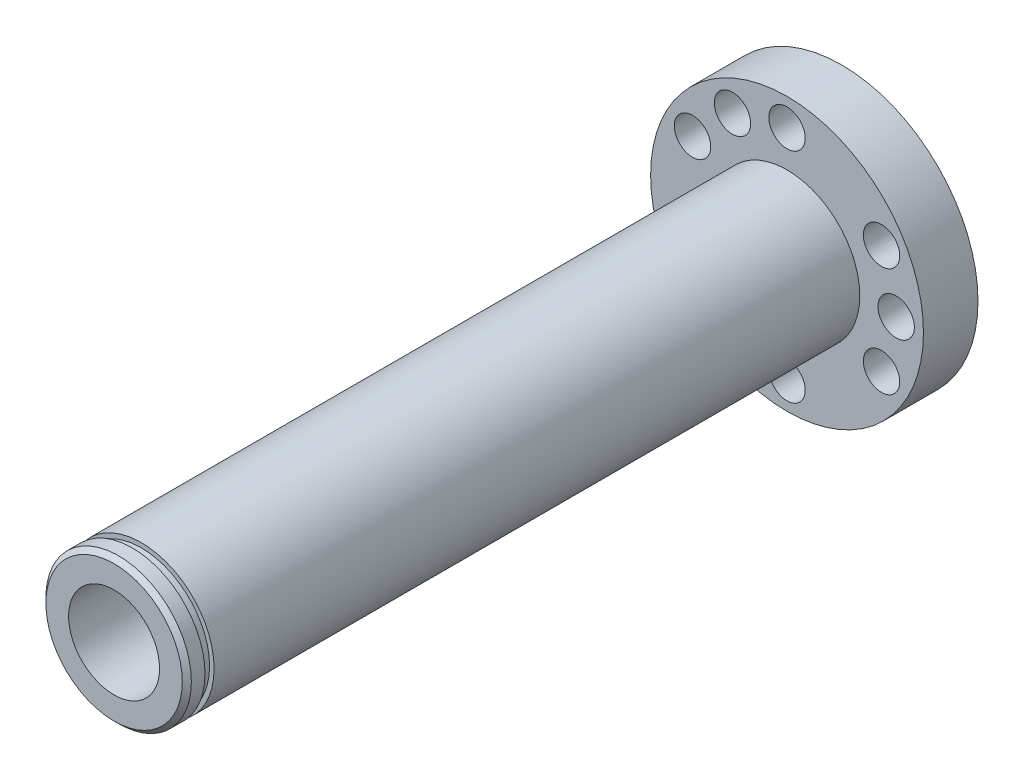
ISO-10303-21;
HEADER;
FILE_DESCRIPTION(('STEP AP214'),'2;1');
FILE_NAME('part.step','',(''),(''),'','','');
FILE_SCHEMA(('AUTOMOTIVE_DESIGN { 1 0 10303 214 1 1 1 1 }'));
ENDSEC;
DATA;
#1=APPLICATION_CONTEXT('core data for automotive mechanical design processes');
#2=APPLICATION_PROTOCOL_DEFINITION('international standard','automotive_design',2000,#1);
#3=PRODUCT_CONTEXT('',#1,'mechanical');
#4=PRODUCT('Part','Part','',(#3));
#5=PRODUCT_RELATED_PRODUCT_CATEGORY('part','',(#4));
#6=PRODUCT_DEFINITION_FORMATION('','',#4);
#7=PRODUCT_DEFINITION_CONTEXT('part definition',#1,'design');
#8=PRODUCT_DEFINITION('design','',#6,#7);
#9=PRODUCT_DEFINITION_SHAPE('','',#8);
#10=(LENGTH_UNIT() NAMED_UNIT(*) SI_UNIT(.MILLI.,.METRE.));
#11=(NAMED_UNIT(*) PLANE_ANGLE_UNIT() SI_UNIT($,.RADIAN.));
#12=(NAMED_UNIT(*) SI_UNIT($,.STERADIAN.) SOLID_ANGLE_UNIT());
#13=UNCERTAINTY_MEASURE_WITH_UNIT(LENGTH_MEASURE(1.E-05),#10,'distance_accuracy_value','');
#14=(GEOMETRIC_REPRESENTATION_CONTEXT(3) GLOBAL_UNCERTAINTY_ASSIGNED_CONTEXT((#13)) GLOBAL_UNIT_ASSIGNED_CONTEXT((#10,
#11,#12)) REPRESENTATION_CONTEXT('',''));
#15=CARTESIAN_POINT('',(0.,0.,0.));
#16=DIRECTION('',(0.,0.,1.));
#17=DIRECTION('',(1.,0.,0.));
#18=AXIS2_PLACEMENT_3D('',#15,#16,#17);
#19=CARTESIAN_POINT('',(0.,0.,80.));
#20=DIRECTION('',(0.,0.,-1.));
#21=DIRECTION('',(-1.,0.,0.));
#22=AXIS2_PLACEMENT_3D('',#19,#20,#21);
#23=CYLINDRICAL_SURFACE('',#22,8.);
#24=CARTESIAN_POINT('',(0.,0.,79.5));
#25=DIRECTION('',(0.,0.,1.));
#26=DIRECTION('',(1.,0.,0.));
#27=AXIS2_PLACEMENT_3D('',#24,#25,#26);
#28=CIRCLE('',#27,8.);
#29=CARTESIAN_POINT('',(8.,0.,79.5));
#30=VERTEX_POINT('',#29);
#31=EDGE_CURVE('E13',#30,#30,#28,.F.);
#32=ORIENTED_EDGE('',*,*,#31,.T.);
#33=EDGE_LOOP('',(#32));
#34=FACE_BOUND('',#33,.T.);
#35=CARTESIAN_POINT('',(0.,0.,78.));
#36=DIRECTION('',(0.,0.,1.));
#37=DIRECTION('',(1.,0.,0.));
#38=AXIS2_PLACEMENT_3D('',#35,#36,#37);
#39=CIRCLE('',#38,8.);
#40=CARTESIAN_POINT('',(8.,0.,78.));
#41=VERTEX_POINT('',#40);
#42=EDGE_CURVE('E57',#41,#41,#39,.T.);
#43=ORIENTED_EDGE('',*,*,#42,.T.);
#44=EDGE_LOOP('',(#43));
#45=FACE_BOUND('',#44,.T.);
#46=ADVANCED_FACE('F41',(#34,#45),#23,.T.);
#47=CARTESIAN_POINT('',(0.,0.,6.));
#48=DIRECTION('',(0.,0.,1.));
#49=DIRECTION('',(1.,0.,0.));
#50=AXIS2_PLACEMENT_3D('',#47,#48,#49);
#51=CIRCLE('',#50,8.);
#52=CARTESIAN_POINT('',(8.,0.,6.));
#53=VERTEX_POINT('',#52);
#54=EDGE_CURVE('E86',#53,#53,#51,.T.);
#55=ORIENTED_EDGE('',*,*,#54,.T.);
#56=EDGE_LOOP('',(#55));
#57=FACE_BOUND('',#56,.T.);
#58=CARTESIAN_POINT('',(0.676832818988865,-7.97131716438002,61.5));
#59=CARTESIAN_POINT('',(0.816152723476275,-7.95948569860907,61.4999975573903));
#60=CARTESIAN_POINT('',(0.955182356315616,-7.94396780468581,61.4883138764017));
#61=CARTESIAN_POINT('',(1.22853718217582,-7.90631197241579,61.4423058152738));
#62=CARTESIAN_POINT('',(1.36286003509707,-7.88417079186767,61.4079703367837));
#63=CARTESIAN_POINT('',(1.62286304428341,-7.834781390873,61.3181685294789));
#64=CARTESIAN_POINT('',(1.74856187779496,-7.80754471584264,61.2627496837744));
#65=CARTESIAN_POINT('',(1.98867007536127,-7.74986822250272,61.1325445753611));
#66=CARTESIAN_POINT('',(2.10307780793544,-7.71942794260518,61.0577555194421));
#67=CARTESIAN_POINT('',(2.32221134305673,-7.65642439165967,60.8875145945021));
#68=CARTESIAN_POINT('',(2.4263960028701,-7.62382449143263,60.7913790250547));
#69=CARTESIAN_POINT('',(2.61732736387712,-7.5604059668264,60.5825613952464));
#70=CARTESIAN_POINT('',(2.70407029192044,-7.52958772889738,60.4698757637329));
#71=CARTESIAN_POINT('',(2.85877237093187,-7.47223827697353,60.2287966500179));
#72=CARTESIAN_POINT('',(2.92643924143155,-7.44577611256991,60.1001981171049));
#73=CARTESIAN_POINT('',(3.03877635688938,-7.40064442830828,59.8320562650993));
#74=CARTESIAN_POINT('',(3.08345994564867,-7.38197038795862,59.6925193510498));
#75=CARTESIAN_POINT('',(3.14587276351866,-7.3555808810127,59.4156102118671));
#76=CARTESIAN_POINT('',(3.16508865060036,-7.34726291169789,59.2786312040606));
#77=CARTESIAN_POINT('',(3.18063000993129,-7.34055022270851,59.003160622223));
#78=CARTESIAN_POINT('',(3.17696426914512,-7.34215169378514,58.8646696492071));
#79=CARTESIAN_POINT('',(3.14784830138872,-7.35467619814316,58.5988940436775));
#80=CARTESIAN_POINT('',(3.12371503319679,-7.36503558807106,58.4714347958744));
#81=CARTESIAN_POINT('',(3.05636822646456,-7.39323568385427,58.2225434037444));
#82=CARTESIAN_POINT('',(3.01315182117508,-7.41107751373296,58.1011121680209));
#83=CARTESIAN_POINT('',(2.90774209272279,-7.45307454694269,57.8640813493935));
#84=CARTESIAN_POINT('',(2.84508179379319,-7.47738273501315,57.7487175069686));
#85=CARTESIAN_POINT('',(2.70303412084004,-7.5298958254571,57.5297779668181));
#86=CARTESIAN_POINT('',(2.62364086323714,-7.55810209725577,57.4262064352415));
#87=CARTESIAN_POINT('',(2.44350683886302,-7.61832891611981,57.2256381561722));
#88=CARTESIAN_POINT('',(2.3416134068799,-7.65047695233039,57.1297128757887));
#89=CARTESIAN_POINT('',(2.12310768799272,-7.71397115168236,56.956039565962));
#90=CARTESIAN_POINT('',(2.00649174979972,-7.7453171135761,56.8782960594217));
#91=CARTESIAN_POINT('',(1.7574460253123,-7.80565668315108,56.7409955286279));
#92=CARTESIAN_POINT('',(1.62463925902297,-7.83454783392614,56.6820738377771));
#93=CARTESIAN_POINT('',(1.34981098484143,-7.88654137035326,56.5879095372691));
#94=CARTESIAN_POINT('',(1.20779229825479,-7.90964551793191,56.5526597149029));
#95=CARTESIAN_POINT('',(0.924507812297479,-7.94763449444304,56.5083361439591));
#96=CARTESIAN_POINT('',(0.783434782221008,-7.96280850164499,56.498281377441));
#97=CARTESIAN_POINT('',(0.501020096605036,-7.98555115301308,56.5021976575859));
#98=CARTESIAN_POINT('',(0.359678529163902,-7.99312196524782,56.5161618521041));
#99=CARTESIAN_POINT('',(0.0875113107585066,-8.00062862557216,56.5666904687729));
#100=CARTESIAN_POINT('',(-0.043501216194487,-8.00089310448273,56.6022082707468));
#101=CARTESIAN_POINT('',(-0.297945069211814,-7.99546318183781,56.6939001948693));
#102=CARTESIAN_POINT('',(-0.421376196367577,-7.98976862400935,56.7500748587094));
#103=CARTESIAN_POINT('',(-0.65778871127648,-7.97379624996889,56.8817062971809));
#104=CARTESIAN_POINT('',(-0.770726249744449,-7.96350016191201,56.9572394256534));
#105=CARTESIAN_POINT('',(-0.982742031358332,-7.94012675140975,57.1253993691777));
#106=CARTESIAN_POINT('',(-1.08181757161549,-7.92704888780784,57.2180295097558));
#107=CARTESIAN_POINT('',(-1.26668859452385,-7.89965415310074,57.4213241629704));
#108=CARTESIAN_POINT('',(-1.35193576615051,-7.88531059545626,57.532484242568));
#109=CARTESIAN_POINT('',(-1.50276953949086,-7.85796281343705,57.7675872396676));
#110=CARTESIAN_POINT('',(-1.56835504238996,-7.8449586639433,57.8915308710727));
#111=CARTESIAN_POINT('',(-1.67851312043485,-7.82213576347272,58.1501304478844));
#112=CARTESIAN_POINT('',(-1.7228803760987,-7.81234841310758,58.2848768908353));
#113=CARTESIAN_POINT('',(-1.78823484894878,-7.79765062179989,58.5601741242955));
#114=CARTESIAN_POINT('',(-1.80922651804465,-7.79273925224004,58.7007238042812));
#115=CARTESIAN_POINT('',(-1.82691676715211,-7.78861056444681,58.9801879582911));
#116=CARTESIAN_POINT('',(-1.82416043030619,-7.78926547966249,59.1190662182135));
#117=CARTESIAN_POINT('',(-1.79574712044427,-7.79586427033478,59.3943242144726));
#118=CARTESIAN_POINT('',(-1.77009064709956,-7.80180803039103,59.5307040052584));
#119=CARTESIAN_POINT('',(-1.69701967920586,-7.81802379862739,59.7959912560694));
#120=CARTESIAN_POINT('',(-1.64978712954827,-7.8282595555297,59.9249512439486));
#121=CARTESIAN_POINT('',(-1.53501415558272,-7.85156955021423,60.1732189087446));
#122=CARTESIAN_POINT('',(-1.46747069484165,-7.86464421232478,60.2925251390607));
#123=CARTESIAN_POINT('',(-1.31215374336306,-7.89205881411277,60.5209998018899));
#124=CARTESIAN_POINT('',(-1.22395850740403,-7.90642063352876,60.6298790461793));
#125=CARTESIAN_POINT('',(-1.03054080705318,-7.93394656034171,60.831500111932));
#126=CARTESIAN_POINT('',(-0.92531606141522,-7.94711050690392,60.9242397679025));
#127=CARTESIAN_POINT('',(-0.69950705512239,-7.97017414452472,61.0918038721571));
#128=CARTESIAN_POINT('',(-0.578783734982513,-7.98004094090107,61.1664458573356));
#129=CARTESIAN_POINT('',(-0.326224183074277,-7.99434357732223,61.294315713331));
#130=CARTESIAN_POINT('',(-0.194394123159528,-7.99878241260586,61.3475553834017));
#131=CARTESIAN_POINT('',(0.0601004951071713,-8.00066211185782,61.4259405656546));
#132=CARTESIAN_POINT('',(0.181962679028228,-7.99887983670041,61.4536933668292));
#133=CARTESIAN_POINT('',(0.428237819034956,-7.98948015901659,61.4907236449033));
#134=CARTESIAN_POINT('',(0.552650628996991,-7.98186308985748,61.5000021772095));
#135=CARTESIAN_POINT('',(0.676832818988865,-7.97131716438002,61.5));
#136=B_SPLINE_CURVE_WITH_KNOTS('',3,(#58,#59,#60,#61,#62,#63,#64,#65,#66,#67,#68,#69,#70,#71,
#72,#73,#74,#75,#76,#77,#78,#79,#80,#81,#82,#83,#84,#85,#86,#87,#88,#89,#90,#91,#92,#93,#94,#95,
#96,#97,#98,#99,#100,#101,#102,#103,#104,#105,#106,#107,#108,#109,#110,#111,#112,#113,#114,#115,
#116,#117,#118,#119,#120,#121,#122,#123,#124,#125,#126,#127,#128,#129,#130,#131,#132,#133,#134,
#135),.UNSPECIFIED.,.T.,.F.,(4,2,2,2,2,2,2,2,2,2,2,2,2,2,2,2,2,2,2,2,2,2,2,2,2,2,2,2,2,2,2,2,2,
2,2,2,2,2,4),(0.,0.418992236702692,0.838189913164174,1.25644902555785,1.67476848508866,
2.10916625723917,2.54365790131059,2.98448389330602,3.42505365761941,3.83857006529578,
4.2519276848623,4.64054535772789,5.02922143024792,5.42806793243236,5.82705491017595,
6.25588948360684,6.68483062084014,7.12701000760924,7.56905460315611,7.99359947304964,
8.41802324859069,8.82332425048391,9.22863588147452,9.63557143187398,10.0425862185582,
10.4630771533692,10.8835915834124,11.3080966984312,11.7325209520865,12.1472298987808,
12.5619297969224,12.9731954282485,13.384522573405,13.8051228493199,14.2257795148891,
14.6505156905575,15.0750173838522,15.4485056263453,15.8219725314136),.UNSPECIFIED.);
#137=CARTESIAN_POINT('',(0.676832818988865,-7.97131716438002,61.5));
#138=VERTEX_POINT('',#137);
#139=EDGE_CURVE('E117',#138,#138,#136,.T.);
#140=ORIENTED_EDGE('',*,*,#139,.T.);
#141=EDGE_LOOP('',(#140));
#142=FACE_BOUND('',#141,.T.);
#143=CARTESIAN_POINT('',(0.,0.,77.));
#144=DIRECTION('',(0.,0.,1.));
#145=DIRECTION('',(1.,0.,0.));
#146=AXIS2_PLACEMENT_3D('',#143,#144,#145);
#147=CIRCLE('',#146,8.);
#148=CARTESIAN_POINT('',(8.,0.,77.));
#149=VERTEX_POINT('',#148);
#150=EDGE_CURVE('E64',#149,#149,#147,.T.);
#151=ORIENTED_EDGE('',*,*,#150,.F.);
#152=EDGE_LOOP('',(#151));
#153=FACE_BOUND('',#152,.T.);
#154=ADVANCED_FACE('F155',(#57,#142,#153),#23,.T.);
#155=CARTESIAN_POINT('',(0.,0.,80.));
#156=DIRECTION('',(0.,0.,-1.));
#157=DIRECTION('',(-1.,0.,0.));
#158=AXIS2_PLACEMENT_3D('',#155,#156,#157);
#159=CONICAL_SURFACE('',#158,7.5,0.785398163397448);
#160=CARTESIAN_POINT('',(0.,0.,80.));
#161=DIRECTION('',(0.,0.,1.));
#162=DIRECTION('',(1.,0.,0.));
#163=AXIS2_PLACEMENT_3D('',#160,#161,#162);
#164=CIRCLE('',#163,7.5);
#165=CARTESIAN_POINT('',(7.5,0.,80.));
#166=VERTEX_POINT('',#165);
#167=EDGE_CURVE('E50',#166,#166,#164,.T.);
#168=ORIENTED_EDGE('',*,*,#167,.F.);
#169=EDGE_LOOP('',(#168));
#170=FACE_BOUND('',#169,.T.);
#171=ORIENTED_EDGE('',*,*,#31,.F.);
#172=EDGE_LOOP('',(#171));
#173=FACE_BOUND('',#172,.T.);
#174=ADVANCED_FACE('F44',(#170,#173),#159,.T.);
#175=CARTESIAN_POINT('',(0.,0.,10.));
#176=DIRECTION('',(0.,0.,-1.));
#177=DIRECTION('',(-1.,0.,0.));
#178=AXIS2_PLACEMENT_3D('',#175,#176,#177);
#179=CYLINDRICAL_SURFACE('',#178,15.);
#180=CARTESIAN_POINT('',(0.,0.,0.));
#181=DIRECTION('',(0.,0.,1.));
#182=DIRECTION('',(1.,0.,0.));
#183=AXIS2_PLACEMENT_3D('',#180,#181,#182);
#184=CIRCLE('',#183,15.);
#185=CARTESIAN_POINT('',(15.,0.,0.));
#186=VERTEX_POINT('',#185);
#187=EDGE_CURVE('E150',#186,#186,#184,.T.);
#188=ORIENTED_EDGE('',*,*,#187,.T.);
#189=EDGE_LOOP('',(#188));
#190=FACE_BOUND('',#189,.T.);
#191=CARTESIAN_POINT('',(0.,0.,6.));
#192=DIRECTION('',(0.,0.,1.));
#193=DIRECTION('',(1.,0.,0.));
#194=AXIS2_PLACEMENT_3D('',#191,#192,#193);
#195=CIRCLE('',#194,15.);
#196=CARTESIAN_POINT('',(15.,0.,6.));
#197=VERTEX_POINT('',#196);
#198=EDGE_CURVE('E114',#197,#197,#195,.T.);
#199=ORIENTED_EDGE('',*,*,#198,.F.);
#200=EDGE_LOOP('',(#199));
#201=FACE_BOUND('',#200,.T.);
#202=ADVANCED_FACE('F191',(#190,#201),#179,.T.);
#203=CARTESIAN_POINT('',(0.,12.,10.));
#204=DIRECTION('',(0.,0.,-1.));
#205=DIRECTION('',(-1.,0.,0.));
#206=AXIS2_PLACEMENT_3D('',#203,#204,#205);
#207=CYLINDRICAL_SURFACE('',#206,2.);
#208=CARTESIAN_POINT('',(0.,12.,0.));
#209=DIRECTION('',(0.,0.,1.));
#210=DIRECTION('',(1.,0.,0.));
#211=AXIS2_PLACEMENT_3D('',#208,#209,#210);
#212=CIRCLE('',#211,2.);
#213=CARTESIAN_POINT('',(2.,12.,0.));
#214=VERTEX_POINT('',#213);
#215=EDGE_CURVE('E200',#214,#214,#212,.T.);
#216=ORIENTED_EDGE('',*,*,#215,.F.);
#217=EDGE_LOOP('',(#216));
#218=FACE_BOUND('',#217,.T.);
#219=CARTESIAN_POINT('',(0.,12.,6.));
#220=DIRECTION('',(0.,0.,1.));
#221=DIRECTION('',(1.,0.,0.));
#222=AXIS2_PLACEMENT_3D('',#219,#220,#221);
#223=CIRCLE('',#222,2.);
#224=CARTESIAN_POINT('',(2.,12.,6.));
#225=VERTEX_POINT('',#224);
#226=EDGE_CURVE('E111',#225,#225,#223,.T.);
#227=ORIENTED_EDGE('',*,*,#226,.T.);
#228=EDGE_LOOP('',(#227));
#229=FACE_BOUND('',#228,.T.);
#230=ADVANCED_FACE('F188',(#218,#229),#207,.F.);
#231=CARTESIAN_POINT('',(-6.00000000000002,10.3923048454133,10.));
#232=DIRECTION('',(0.,0.,-1.));
#233=DIRECTION('',(-1.,0.,0.));
#234=AXIS2_PLACEMENT_3D('',#231,#232,#233);
#235=CYLINDRICAL_SURFACE('',#234,2.);
#236=CARTESIAN_POINT('',(-6.00000000000002,10.3923048454133,0.));
#237=DIRECTION('',(0.,0.,1.));
#238=DIRECTION('',(1.,0.,0.));
#239=AXIS2_PLACEMENT_3D('',#236,#237,#238);
#240=CIRCLE('',#239,2.);
#241=CARTESIAN_POINT('',(-4.00000000000002,10.3923048454133,0.));
#242=VERTEX_POINT('',#241);
#243=EDGE_CURVE('E263',#242,#242,#240,.T.);
#244=ORIENTED_EDGE('',*,*,#243,.F.);
#245=EDGE_LOOP('',(#244));
#246=FACE_BOUND('',#245,.T.);
#247=CARTESIAN_POINT('',(-6.00000000000002,10.3923048454133,6.));
#248=DIRECTION('',(0.,0.,1.));
#249=DIRECTION('',(1.,0.,0.));
#250=AXIS2_PLACEMENT_3D('',#247,#248,#249);
#251=CIRCLE('',#250,2.);
#252=CARTESIAN_POINT('',(-4.00000000000002,10.3923048454133,6.));
#253=VERTEX_POINT('',#252);
#254=EDGE_CURVE('E108',#253,#253,#251,.T.);
#255=ORIENTED_EDGE('',*,*,#254,.T.);
#256=EDGE_LOOP('',(#255));
#257=FACE_BOUND('',#256,.T.);
#258=ADVANCED_FACE('F185',(#246,#257),#235,.F.);
#259=CARTESIAN_POINT('',(10.3923048454133,6.00000000000059,10.));
#260=DIRECTION('',(0.,0.,-1.));
#261=DIRECTION('',(-1.,0.,0.));
#262=AXIS2_PLACEMENT_3D('',#259,#260,#261);
#263=CYLINDRICAL_SURFACE('',#262,2.00000000000043);
#264=CARTESIAN_POINT('',(10.3923048454133,6.00000000000059,0.));
#265=DIRECTION('',(0.,0.,1.));
#266=DIRECTION('',(1.,0.,0.));
#267=AXIS2_PLACEMENT_3D('',#264,#265,#266);
#268=CIRCLE('',#267,2.00000000000043);
#269=CARTESIAN_POINT('',(12.3923048454137,6.00000000000059,0.));
#270=VERTEX_POINT('',#269);
#271=EDGE_CURVE('E268',#270,#270,#268,.T.);
#272=ORIENTED_EDGE('',*,*,#271,.F.);
#273=EDGE_LOOP('',(#272));
#274=FACE_BOUND('',#273,.T.);
#275=CARTESIAN_POINT('',(10.3923048454133,6.00000000000059,6.));
#276=DIRECTION('',(0.,0.,1.));
#277=DIRECTION('',(1.,0.,0.));
#278=AXIS2_PLACEMENT_3D('',#275,#276,#277);
#279=CIRCLE('',#278,2.00000000000043);
#280=CARTESIAN_POINT('',(12.3923048454137,6.00000000000059,6.));
#281=VERTEX_POINT('',#280);
#282=EDGE_CURVE('E105',#281,#281,#279,.T.);
#283=ORIENTED_EDGE('',*,*,#282,.T.);
#284=EDGE_LOOP('',(#283));
#285=FACE_BOUND('',#284,.T.);
#286=ADVANCED_FACE('F181',(#274,#285),#263,.F.);
#287=CARTESIAN_POINT('',(10.3923048454138,-5.99999999999911,10.));
#288=DIRECTION('',(0.,0.,-1.));
#289=DIRECTION('',(-1.,0.,0.));
#290=AXIS2_PLACEMENT_3D('',#287,#288,#289);
#291=CYLINDRICAL_SURFACE('',#290,2.00000000000103);
#292=CARTESIAN_POINT('',(10.3923048454138,-5.99999999999911,0.));
#293=DIRECTION('',(0.,0.,1.));
#294=DIRECTION('',(1.,0.,0.));
#295=AXIS2_PLACEMENT_3D('',#292,#293,#294);
#296=CIRCLE('',#295,2.00000000000103);
#297=CARTESIAN_POINT('',(12.3923048454148,-5.99999999999911,0.));
#298=VERTEX_POINT('',#297);
#299=EDGE_CURVE('E271',#298,#298,#296,.T.);
#300=ORIENTED_EDGE('',*,*,#299,.F.);
#301=EDGE_LOOP('',(#300));
#302=FACE_BOUND('',#301,.T.);
#303=CARTESIAN_POINT('',(10.3923048454138,-5.99999999999911,6.));
#304=DIRECTION('',(0.,0.,1.));
#305=DIRECTION('',(1.,0.,0.));
#306=AXIS2_PLACEMENT_3D('',#303,#304,#305);
#307=CIRCLE('',#306,2.00000000000103);
#308=CARTESIAN_POINT('',(12.3923048454148,-5.99999999999911,6.));
#309=VERTEX_POINT('',#308);
#310=EDGE_CURVE('E102',#309,#309,#307,.T.);
#311=ORIENTED_EDGE('',*,*,#310,.T.);
#312=EDGE_LOOP('',(#311));
#313=FACE_BOUND('',#312,.T.);
#314=ADVANCED_FACE('F177',(#302,#313),#291,.F.);
#315=CARTESIAN_POINT('',(1.01532524224664E-12,-11.9999999999994,10.));
#316=DIRECTION('',(0.,0.,-1.));
#317=DIRECTION('',(-1.,0.,0.));
#318=AXIS2_PLACEMENT_3D('',#315,#316,#317);
#319=CYLINDRICAL_SURFACE('',#318,2.00000000000123);
#320=CARTESIAN_POINT('',(1.01532524224664E-12,-11.9999999999994,0.));
#321=DIRECTION('',(0.,0.,1.));
#322=DIRECTION('',(1.,0.,0.));
#323=AXIS2_PLACEMENT_3D('',#320,#321,#322);
#324=CIRCLE('',#323,2.00000000000123);
#325=CARTESIAN_POINT('',(2.00000000000224,-11.9999999999994,0.));
#326=VERTEX_POINT('',#325);
#327=EDGE_CURVE('E274',#326,#326,#324,.T.);
#328=ORIENTED_EDGE('',*,*,#327,.F.);
#329=EDGE_LOOP('',(#328));
#330=FACE_BOUND('',#329,.T.);
#331=CARTESIAN_POINT('',(1.01532524224664E-12,-11.9999999999994,6.));
#332=DIRECTION('',(0.,0.,1.));
#333=DIRECTION('',(1.,0.,0.));
#334=AXIS2_PLACEMENT_3D('',#331,#332,#333);
#335=CIRCLE('',#334,2.00000000000123);
#336=CARTESIAN_POINT('',(2.00000000000224,-11.9999999999994,6.));
#337=VERTEX_POINT('',#336);
#338=EDGE_CURVE('E99',#337,#337,#335,.T.);
#339=ORIENTED_EDGE('',*,*,#338,.T.);
#340=EDGE_LOOP('',(#339));
#341=FACE_BOUND('',#340,.T.);
#342=ADVANCED_FACE('F173',(#330,#341),#319,.F.);
#343=CARTESIAN_POINT('',(-10.3923048454122,-6.,10.));
#344=DIRECTION('',(0.,0.,-1.));
#345=DIRECTION('',(-1.,0.,0.));
#346=AXIS2_PLACEMENT_3D('',#343,#344,#345);
#347=CYLINDRICAL_SURFACE('',#346,2.00000000000085);
#348=CARTESIAN_POINT('',(-10.3923048454122,-6.,0.));
#349=DIRECTION('',(0.,0.,1.));
#350=DIRECTION('',(1.,0.,0.));
#351=AXIS2_PLACEMENT_3D('',#348,#349,#350);
#352=CIRCLE('',#351,2.00000000000085);
#353=CARTESIAN_POINT('',(-8.3923048454114,-6.,0.));
#354=VERTEX_POINT('',#353);
#355=EDGE_CURVE('E277',#354,#354,#352,.T.);
#356=ORIENTED_EDGE('',*,*,#355,.F.);
#357=EDGE_LOOP('',(#356));
#358=FACE_BOUND('',#357,.T.);
#359=CARTESIAN_POINT('',(-10.3923048454122,-6.,6.));
#360=DIRECTION('',(0.,0.,1.));
#361=DIRECTION('',(1.,0.,0.));
#362=AXIS2_PLACEMENT_3D('',#359,#360,#361);
#363=CIRCLE('',#362,2.00000000000085);
#364=CARTESIAN_POINT('',(-8.3923048454114,-6.,6.));
#365=VERTEX_POINT('',#364);
#366=EDGE_CURVE('E96',#365,#365,#363,.T.);
#367=ORIENTED_EDGE('',*,*,#366,.T.);
#368=EDGE_LOOP('',(#367));
#369=FACE_BOUND('',#368,.T.);
#370=ADVANCED_FACE('F169',(#358,#369),#347,.F.);
#371=CARTESIAN_POINT('',(-10.3923048454128,5.99999999999971,10.));
#372=DIRECTION('',(0.,0.,-1.));
#373=DIRECTION('',(-1.,0.,0.));
#374=AXIS2_PLACEMENT_3D('',#371,#372,#373);
#375=CYLINDRICAL_SURFACE('',#374,2.00000000000031);
#376=CARTESIAN_POINT('',(-10.3923048454128,5.99999999999971,0.));
#377=DIRECTION('',(0.,0.,1.));
#378=DIRECTION('',(1.,0.,0.));
#379=AXIS2_PLACEMENT_3D('',#376,#377,#378);
#380=CIRCLE('',#379,2.00000000000031);
#381=CARTESIAN_POINT('',(-8.39230484541245,5.99999999999971,0.));
#382=VERTEX_POINT('',#381);
#383=EDGE_CURVE('E280',#382,#382,#380,.T.);
#384=ORIENTED_EDGE('',*,*,#383,.F.);
#385=EDGE_LOOP('',(#384));
#386=FACE_BOUND('',#385,.T.);
#387=CARTESIAN_POINT('',(-10.3923048454128,5.99999999999971,6.));
#388=DIRECTION('',(0.,0.,1.));
#389=DIRECTION('',(1.,0.,0.));
#390=AXIS2_PLACEMENT_3D('',#387,#388,#389);
#391=CIRCLE('',#390,2.00000000000031);
#392=CARTESIAN_POINT('',(-8.39230484541245,5.99999999999971,6.));
#393=VERTEX_POINT('',#392);
#394=EDGE_CURVE('E93',#393,#393,#391,.T.);
#395=ORIENTED_EDGE('',*,*,#394,.T.);
#396=EDGE_LOOP('',(#395));
#397=FACE_BOUND('',#396,.T.);
#398=ADVANCED_FACE('F165',(#386,#397),#375,.F.);
#399=CARTESIAN_POINT('',(12.0000000000004,8.14669512405608E-13,10.));
#400=DIRECTION('',(0.,0.,-1.));
#401=DIRECTION('',(-1.,0.,0.));
#402=AXIS2_PLACEMENT_3D('',#399,#400,#401);
#403=CYLINDRICAL_SURFACE('',#402,2.);
#404=CARTESIAN_POINT('',(12.0000000000004,8.14669512405608E-13,0.));
#405=DIRECTION('',(0.,0.,1.));
#406=DIRECTION('',(1.,0.,0.));
#407=AXIS2_PLACEMENT_3D('',#404,#405,#406);
#408=CIRCLE('',#407,2.);
#409=CARTESIAN_POINT('',(14.0000000000004,8.14669512405608E-13,0.));
#410=VERTEX_POINT('',#409);
#411=EDGE_CURVE('E283',#410,#410,#408,.T.);
#412=ORIENTED_EDGE('',*,*,#411,.F.);
#413=EDGE_LOOP('',(#412));
#414=FACE_BOUND('',#413,.T.);
#415=CARTESIAN_POINT('',(12.0000000000004,8.14669512405608E-13,6.));
#416=DIRECTION('',(0.,0.,1.));
#417=DIRECTION('',(1.,0.,0.));
#418=AXIS2_PLACEMENT_3D('',#415,#416,#417);
#419=CIRCLE('',#418,2.);
#420=CARTESIAN_POINT('',(14.0000000000004,8.14669512405608E-13,6.));
#421=VERTEX_POINT('',#420);
#422=EDGE_CURVE('E90',#421,#421,#419,.T.);
#423=ORIENTED_EDGE('',*,*,#422,.T.);
#424=EDGE_LOOP('',(#423));
#425=FACE_BOUND('',#424,.T.);
#426=ADVANCED_FACE('F161',(#414,#425),#403,.F.);
#427=CARTESIAN_POINT('',(-5.99999999999911,-10.3923048454132,10.));
#428=DIRECTION('',(0.,0.,-1.));
#429=DIRECTION('',(-1.,0.,0.));
#430=AXIS2_PLACEMENT_3D('',#427,#428,#429);
#431=CYLINDRICAL_SURFACE('',#430,2.);
#432=CARTESIAN_POINT('',(-5.99999999999911,-10.3923048454132,0.));
#433=DIRECTION('',(0.,0.,1.));
#434=DIRECTION('',(1.,0.,0.));
#435=AXIS2_PLACEMENT_3D('',#432,#433,#434);
#436=CIRCLE('',#435,2.);
#437=CARTESIAN_POINT('',(-3.99999999999911,-10.3923048454132,0.));
#438=VERTEX_POINT('',#437);
#439=EDGE_CURVE('E285',#438,#438,#436,.T.);
#440=ORIENTED_EDGE('',*,*,#439,.F.);
#441=EDGE_LOOP('',(#440));
#442=FACE_BOUND('',#441,.T.);
#443=CARTESIAN_POINT('',(-5.99999999999911,-10.3923048454132,6.));
#444=DIRECTION('',(0.,0.,1.));
#445=DIRECTION('',(1.,0.,0.));
#446=AXIS2_PLACEMENT_3D('',#443,#444,#445);
#447=CIRCLE('',#446,2.);
#448=CARTESIAN_POINT('',(-3.99999999999911,-10.3923048454132,6.));
#449=VERTEX_POINT('',#448);
#450=EDGE_CURVE('E89',#449,#449,#447,.T.);
#451=ORIENTED_EDGE('',*,*,#450,.T.);
#452=EDGE_LOOP('',(#451));
#453=FACE_BOUND('',#452,.T.);
#454=ADVANCED_FACE('F157',(#442,#453),#431,.F.);
#455=CARTESIAN_POINT('',(0.,0.,0.));
#456=DIRECTION('',(0.,0.,1.));
#457=DIRECTION('',(1.,0.,0.));
#458=AXIS2_PLACEMENT_3D('',#455,#456,#457);
#459=PLANE('',#458);
#460=ORIENTED_EDGE('',*,*,#187,.F.);
#461=EDGE_LOOP('',(#460));
#462=FACE_BOUND('',#461,.T.);
#463=CARTESIAN_POINT('',(0.,0.,0.));
#464=DIRECTION('',(0.,0.,1.));
#465=DIRECTION('',(1.,0.,0.));
#466=AXIS2_PLACEMENT_3D('',#463,#464,#465);
#467=CIRCLE('',#466,5.);
#468=CARTESIAN_POINT('',(5.,0.,0.));
#469=VERTEX_POINT('',#468);
#470=EDGE_CURVE('E258',#469,#469,#467,.T.);
#471=ORIENTED_EDGE('',*,*,#470,.T.);
#472=EDGE_LOOP('',(#471));
#473=FACE_BOUND('',#472,.T.);
#474=ORIENTED_EDGE('',*,*,#215,.T.);
#475=EDGE_LOOP('',(#474));
#476=FACE_BOUND('',#475,.T.);
#477=ORIENTED_EDGE('',*,*,#243,.T.);
#478=EDGE_LOOP('',(#477));
#479=FACE_BOUND('',#478,.T.);
#480=ORIENTED_EDGE('',*,*,#271,.T.);
#481=EDGE_LOOP('',(#480));
#482=FACE_BOUND('',#481,.T.);
#483=ORIENTED_EDGE('',*,*,#299,.T.);
#484=EDGE_LOOP('',(#483));
#485=FACE_BOUND('',#484,.T.);
#486=ORIENTED_EDGE('',*,*,#327,.T.);
#487=EDGE_LOOP('',(#486));
#488=FACE_BOUND('',#487,.T.);
#489=ORIENTED_EDGE('',*,*,#355,.T.);
#490=EDGE_LOOP('',(#489));
#491=FACE_BOUND('',#490,.T.);
#492=ORIENTED_EDGE('',*,*,#383,.T.);
#493=EDGE_LOOP('',(#492));
#494=FACE_BOUND('',#493,.T.);
#495=ORIENTED_EDGE('',*,*,#411,.T.);
#496=EDGE_LOOP('',(#495));
#497=FACE_BOUND('',#496,.T.);
#498=ORIENTED_EDGE('',*,*,#439,.T.);
#499=EDGE_LOOP('',(#498));
#500=FACE_BOUND('',#499,.T.);
#501=ADVANCED_FACE('F160',(#462,#473,#476,#479,#482,#485,#488,#491,#494,#497,#500),#459,.F.);
#502=CARTESIAN_POINT('',(0.,0.,10.));
#503=DIRECTION('',(0.,0.,-1.));
#504=DIRECTION('',(-1.,0.,0.));
#505=AXIS2_PLACEMENT_3D('',#502,#503,#504);
#506=CYLINDRICAL_SURFACE('',#505,5.);
#507=CARTESIAN_POINT('',(0.676832818988865,-4.95397793042516,61.5));
#508=CARTESIAN_POINT('',(0.813684276789551,-4.93527458446858,61.4999939747066));
#509=CARTESIAN_POINT('',(0.949811852821948,-4.91084677858323,61.4887069716417));
#510=CARTESIAN_POINT('',(1.21632295055549,-4.85172768516086,61.444840836495));
#511=CARTESIAN_POINT('',(1.34669980738018,-4.81702483061967,61.4122376577578));
#512=CARTESIAN_POINT('',(1.59773122099765,-4.73966530073637,61.3279591583336));
#513=CARTESIAN_POINT('',(1.71843234285199,-4.69705046150076,61.2763828153634));
#514=CARTESIAN_POINT('',(1.94871259665441,-4.60628485483729,61.1562026074469));
#515=CARTESIAN_POINT('',(2.05828885209875,-4.55813266247155,61.0875943543592));
#516=CARTESIAN_POINT('',(2.27467271281387,-4.45438980904055,60.9278690518775));
#517=CARTESIAN_POINT('',(2.3802275025102,-4.39852712998813,60.8352325078324));
#518=CARTESIAN_POINT('',(2.57467640109206,-4.28760706812924,60.6333526444576));
#519=CARTESIAN_POINT('',(2.66356423449287,-4.23254999581672,60.5241030978843));
#520=CARTESIAN_POINT('',(2.81505403014268,-4.13314333558741,60.3016627129012));
#521=CARTESIAN_POINT('',(2.87936627028854,-4.08827316917391,60.1898735159393));
#522=CARTESIAN_POINT('',(2.99083633020165,-4.00744924457663,59.9550959550481));
#523=CARTESIAN_POINT('',(3.03802041985341,-3.97148185915685,59.8321251060869));
#524=CARTESIAN_POINT('',(3.10655220555324,-3.91802292987811,59.5988593390014));
#525=CARTESIAN_POINT('',(3.13092111300568,-3.89843464523424,59.4899416373694));
#526=CARTESIAN_POINT('',(3.16490038918996,-3.87090455303619,59.2684088533523));
#527=CARTESIAN_POINT('',(3.17452447197337,-3.86295192355613,59.1557973063021));
#528=CARTESIAN_POINT('',(3.17840645937765,-3.85975929679902,58.9299148183502));
#529=CARTESIAN_POINT('',(3.17263600043943,-3.8645427650184,58.8166430445131));
#530=CARTESIAN_POINT('',(3.1460605770082,-3.88620387903667,58.593045347671));
#531=CARTESIAN_POINT('',(3.12524549503873,-3.90308966355301,58.4827214589128));
#532=CARTESIAN_POINT('',(3.07014275347286,-3.94657053269089,58.2691904715905));
#533=CARTESIAN_POINT('',(3.03603519219126,-3.97303550202317,58.1659090650637));
#534=CARTESIAN_POINT('',(2.95571889489074,-4.0331422983104,57.9664358410614));
#535=CARTESIAN_POINT('',(2.9095057649247,-4.06678673036467,57.8702466141066));
#536=CARTESIAN_POINT('',(2.79659184042487,-4.1454347354762,57.6687127549889));
#537=CARTESIAN_POINT('',(2.72768085194558,-4.19138773684319,57.5649791947811));
#538=CARTESIAN_POINT('',(2.57607000270551,-4.28624323634189,57.3695963939984));
#539=CARTESIAN_POINT('',(2.49335756045612,-4.33514839948042,57.2779583175162));
#540=CARTESIAN_POINT('',(2.29845591978854,-4.44203109425938,57.0916595859663));
#541=CARTESIAN_POINT('',(2.18364969110385,-4.49997899527213,56.999692218335));
#542=CARTESIAN_POINT('',(1.93805622245796,-4.61108792368252,56.8364210109672));
#543=CARTESIAN_POINT('',(1.8072657191704,-4.66424796973784,56.7651214007821));
#544=CARTESIAN_POINT('',(1.53199137420625,-4.76174598099644,56.6460414378613));
#545=CARTESIAN_POINT('',(1.3875006138694,-4.80607945335341,56.5982730446916));
#546=CARTESIAN_POINT('',(1.16397802302241,-4.86324167879159,56.5467248684567));
#547=CARTESIAN_POINT('',(1.08833670321654,-4.88073986401955,56.5328927488577));
#548=CARTESIAN_POINT('',(0.935415045767168,-4.91234079832505,56.5122122367267));
#549=CARTESIAN_POINT('',(0.858134993724678,-4.92644413385592,56.5053626373165));
#550=CARTESIAN_POINT('',(0.645191085706808,-4.96007783441332,56.4965515324268));
#551=CARTESIAN_POINT('',(0.50854398349693,-4.97592821315383,56.5019317724546));
#552=CARTESIAN_POINT('',(0.237245042475912,-4.99622294451181,56.5351571850841));
#553=CARTESIAN_POINT('',(0.102592509514351,-5.00067136259882,56.5629943458169));
#554=CARTESIAN_POINT('',(-0.150389101794989,-4.99921902769653,56.6374216532991));
#555=CARTESIAN_POINT('',(-0.269185911975509,-4.99406718963998,56.6824540697074));
#556=CARTESIAN_POINT('',(-0.49813943715511,-4.97644993909508,56.789699065089));
#557=CARTESIAN_POINT('',(-0.608295127322003,-4.96398366060028,56.851913677918));
#558=CARTESIAN_POINT('',(-0.821723716740942,-4.93324146982845,56.9946387167989));
#559=CARTESIAN_POINT('',(-0.924537072157042,-4.914750682421,57.0757881662871));
#560=CARTESIAN_POINT('',(-1.11599815885112,-4.8748466528853,57.2527815299252));
#561=CARTESIAN_POINT('',(-1.20463909399059,-4.85343201774736,57.3486324510036));
#562=CARTESIAN_POINT('',(-1.37211150863875,-4.8088864503207,57.560748599561));
#563=CARTESIAN_POINT('',(-1.44968049420037,-4.78574910056202,57.6780129255118));
#564=CARTESIAN_POINT('',(-1.58430243484966,-4.74288918546316,57.9243757522799));
#565=CARTESIAN_POINT('',(-1.64135569251881,-4.72316656976213,58.0534740785253));
#566=CARTESIAN_POINT('',(-1.73324886992758,-4.69023049082402,58.3206535350557));
#567=CARTESIAN_POINT('',(-1.76801855604245,-4.67703763763253,58.4587615699639));
#568=CARTESIAN_POINT('',(-1.81360188051272,-4.65955676393848,58.739395933664));
#569=CARTESIAN_POINT('',(-1.82442921317765,-4.65526365313757,58.8819196894643));
#570=CARTESIAN_POINT('',(-1.82175766511603,-4.65630569624796,59.1575278808973));
#571=CARTESIAN_POINT('',(-1.8097728032181,-4.66104163615368,59.2906320833147));
#572=CARTESIAN_POINT('',(-1.7649183818255,-4.67820795516676,59.5527533718944));
#573=CARTESIAN_POINT('',(-1.73204614708838,-4.69063931989435,59.6817699322915));
#574=CARTESIAN_POINT('',(-1.64668571807648,-4.72127712049227,59.9320497308726));
#575=CARTESIAN_POINT('',(-1.59423999974699,-4.73947103833887,60.0533290968481));
#576=CARTESIAN_POINT('',(-1.47122250492703,-4.77908660580743,60.2857533016552));
#577=CARTESIAN_POINT('',(-1.40064436990565,-4.80050938660975,60.3968945667748));
#578=CARTESIAN_POINT('',(-1.23784089721013,-4.84513326261376,60.613554512454));
#579=CARTESIAN_POINT('',(-1.14450541507802,-4.8683593343052,60.7182361088248));
#580=CARTESIAN_POINT('',(-0.941240056378816,-4.91170538054321,60.9108755205878));
#581=CARTESIAN_POINT('',(-0.831306569294791,-4.93182467735102,60.9988296878804));
#582=CARTESIAN_POINT('',(-0.596596718276701,-4.96570495468469,61.1560319679688));
#583=CARTESIAN_POINT('',(-0.471712677839693,-4.97941583182246,61.2251309753103));
#584=CARTESIAN_POINT('',(-0.211491853982702,-4.99721845907113,61.3411760734205));
#585=CARTESIAN_POINT('',(-0.0761696514437509,-5.00132338493157,61.3881524373556));
#586=CARTESIAN_POINT('',(0.162730215581794,-4.99837054151447,61.448780207371));
#587=CARTESIAN_POINT('',(0.264962533643499,-4.99403852184648,61.4680145566603));
#588=CARTESIAN_POINT('',(0.47054408795439,-4.97887629830759,61.493626243607));
#589=CARTESIAN_POINT('',(0.573893241023181,-4.96804657514593,61.5000045322218));
#590=CARTESIAN_POINT('',(0.676832818988865,-4.95397793042516,61.5));
#591=B_SPLINE_CURVE_WITH_KNOTS('',3,(#507,#508,#509,#510,#511,#512,#513,#514,#515,#516,#517,
#518,#519,#520,#521,#522,#523,#524,#525,#526,#527,#528,#529,#530,#531,#532,#533,#534,#535,#536,
#537,#538,#539,#540,#541,#542,#543,#544,#545,#546,#547,#548,#549,#550,#551,#552,#553,#554,#555,
#556,#557,#558,#559,#560,#561,#562,#563,#564,#565,#566,#567,#568,#569,#570,#571,#572,#573,#574,
#575,#576,#577,#578,#579,#580,#581,#582,#583,#584,#585,#586,#587,#588,#589,#590),.UNSPECIFIED.,
.T.,.F.,(4,2,2,2,2,2,2,2,2,2,2,2,2,2,2,2,2,2,2,2,2,2,2,2,2,2,2,2,2,2,2,2,2,2,2,2,2,2,2,2,2,4),
(0.,0.413944519661079,0.828356815354445,1.24063720519894,1.6530239263742,2.10460256033147,
2.55635088388481,2.96443428402723,3.37188912502541,3.71038154950727,4.04855895316952,
4.38735985938405,4.72638882072165,5.06097564477319,5.39568408218104,5.79247468030884,
6.18962899134309,6.66173422025617,7.13393599500817,7.60637751582329,7.84261450396155,
8.07881065331106,8.48937843690466,8.89979980856011,9.27953496903614,9.6593150980212,
10.0544789155774,10.449831662411,10.8753158011566,11.3007936642828,11.7276060428993,
12.1541742343967,12.5534143560641,12.9527056224817,13.3511353877039,13.7497050622532,
14.1742223395046,14.598832094195,15.0267082542825,15.4539971844548,15.7653890185385,
16.076757818257),.UNSPECIFIED.);
#592=CARTESIAN_POINT('',(0.676832818988865,-4.95397793042516,61.5));
#593=VERTEX_POINT('',#592);
#594=EDGE_CURVE('E118',#593,#593,#591,.T.);
#595=ORIENTED_EDGE('',*,*,#594,.F.);
#596=EDGE_LOOP('',(#595));
#597=FACE_BOUND('',#596,.T.);
#598=ORIENTED_EDGE('',*,*,#470,.F.);
#599=EDGE_LOOP('',(#598));
#600=FACE_BOUND('',#599,.T.);
#601=CARTESIAN_POINT('',(0.,0.,80.));
#602=DIRECTION('',(0.,0.,1.));
#603=DIRECTION('',(1.,0.,0.));
#604=AXIS2_PLACEMENT_3D('',#601,#602,#603);
#605=CIRCLE('',#604,5.);
#606=CARTESIAN_POINT('',(5.,0.,80.));
#607=VERTEX_POINT('',#606);
#608=EDGE_CURVE('E126',#607,#607,#605,.T.);
#609=ORIENTED_EDGE('',*,*,#608,.T.);
#610=EDGE_LOOP('',(#609));
#611=FACE_BOUND('',#610,.T.);
#612=ADVANCED_FACE('F128',(#597,#600,#611),#506,.F.);
#613=CARTESIAN_POINT('',(0.,0.,80.));
#614=DIRECTION('',(0.,0.,1.));
#615=DIRECTION('',(1.,0.,0.));
#616=AXIS2_PLACEMENT_3D('',#613,#614,#615);
#617=PLANE('',#616);
#618=ORIENTED_EDGE('',*,*,#167,.T.);
#619=EDGE_LOOP('',(#618));
#620=FACE_BOUND('',#619,.T.);
#621=ORIENTED_EDGE('',*,*,#608,.F.);
#622=EDGE_LOOP('',(#621));
#623=FACE_BOUND('',#622,.T.);
#624=ADVANCED_FACE('F138',(#620,#623),#617,.T.);
#625=CARTESIAN_POINT('',(0.676832818988865,-10.,59.));
#626=DIRECTION('',(0.,1.,0.));
#627=DIRECTION('',(0.,0.,1.));
#628=AXIS2_PLACEMENT_3D('',#625,#626,#627);
#629=CYLINDRICAL_SURFACE('',#628,2.5);
#630=ORIENTED_EDGE('',*,*,#594,.T.);
#631=EDGE_LOOP('',(#630));
#632=FACE_BOUND('',#631,.T.);
#633=ORIENTED_EDGE('',*,*,#139,.F.);
#634=EDGE_LOOP('',(#633));
#635=FACE_BOUND('',#634,.T.);
#636=ADVANCED_FACE('F132',(#632,#635),#629,.F.);
#637=CARTESIAN_POINT('',(0.,0.,6.));
#638=DIRECTION('',(0.,0.,1.));
#639=DIRECTION('',(1.,0.,0.));
#640=AXIS2_PLACEMENT_3D('',#637,#638,#639);
#641=PLANE('',#640);
#642=ORIENTED_EDGE('',*,*,#54,.F.);
#643=EDGE_LOOP('',(#642));
#644=FACE_BOUND('',#643,.T.);
#645=ORIENTED_EDGE('',*,*,#450,.F.);
#646=EDGE_LOOP('',(#645));
#647=FACE_BOUND('',#646,.T.);
#648=ORIENTED_EDGE('',*,*,#422,.F.);
#649=EDGE_LOOP('',(#648));
#650=FACE_BOUND('',#649,.T.);
#651=ORIENTED_EDGE('',*,*,#394,.F.);
#652=EDGE_LOOP('',(#651));
#653=FACE_BOUND('',#652,.T.);
#654=ORIENTED_EDGE('',*,*,#366,.F.);
#655=EDGE_LOOP('',(#654));
#656=FACE_BOUND('',#655,.T.);
#657=ORIENTED_EDGE('',*,*,#338,.F.);
#658=EDGE_LOOP('',(#657));
#659=FACE_BOUND('',#658,.T.);
#660=ORIENTED_EDGE('',*,*,#310,.F.);
#661=EDGE_LOOP('',(#660));
#662=FACE_BOUND('',#661,.T.);
#663=ORIENTED_EDGE('',*,*,#282,.F.);
#664=EDGE_LOOP('',(#663));
#665=FACE_BOUND('',#664,.T.);
#666=ORIENTED_EDGE('',*,*,#254,.F.);
#667=EDGE_LOOP('',(#666));
#668=FACE_BOUND('',#667,.T.);
#669=ORIENTED_EDGE('',*,*,#226,.F.);
#670=EDGE_LOOP('',(#669));
#671=FACE_BOUND('',#670,.T.);
#672=ORIENTED_EDGE('',*,*,#198,.T.);
#673=EDGE_LOOP('',(#672));
#674=FACE_BOUND('',#673,.T.);
#675=ADVANCED_FACE('F137',(#644,#647,#650,#653,#656,#659,#662,#665,#668,#671,#674),#641,.T.);
#676=CARTESIAN_POINT('',(8.,0.,78.));
#677=DIRECTION('',(0.,0.,-1.));
#678=DIRECTION('',(-1.,0.,0.));
#679=AXIS2_PLACEMENT_3D('',#676,#677,#678);
#680=PLANE('',#679);
#681=CARTESIAN_POINT('',(0.,0.,78.));
#682=DIRECTION('',(0.,0.,1.));
#683=DIRECTION('',(1.,0.,0.));
#684=AXIS2_PLACEMENT_3D('',#681,#682,#683);
#685=CIRCLE('',#684,7.5);
#686=CARTESIAN_POINT('',(7.5,0.,78.));
#687=VERTEX_POINT('',#686);
#688=EDGE_CURVE('E73',#687,#687,#685,.T.);
#689=ORIENTED_EDGE('',*,*,#688,.T.);
#690=EDGE_LOOP('',(#689));
#691=FACE_BOUND('',#690,.T.);
#692=ORIENTED_EDGE('',*,*,#42,.F.);
#693=EDGE_LOOP('',(#692));
#694=FACE_BOUND('',#693,.T.);
#695=ADVANCED_FACE('F71',(#691,#694),#680,.T.);
#696=CARTESIAN_POINT('',(0.,0.,80.));
#697=DIRECTION('',(0.,0.,1.));
#698=DIRECTION('',(1.,0.,0.));
#699=AXIS2_PLACEMENT_3D('',#696,#697,#698);
#700=CYLINDRICAL_SURFACE('',#699,7.5);
#701=DIRECTION('',(0.,0.,-1.));
#702=VECTOR('',#701,1.);
#703=CARTESIAN_POINT('',(7.5,0.,78.));
#704=LINE('',#703,#702);
#705=CARTESIAN_POINT('',(7.5,0.,77.));
#706=VERTEX_POINT('',#705);
#707=EDGE_CURVE('E74',#687,#706,#704,.T.);
#708=ORIENTED_EDGE('',*,*,#707,.F.);
#709=ORIENTED_EDGE('',*,*,#688,.F.);
#710=ORIENTED_EDGE('',*,*,#707,.T.);
#711=CARTESIAN_POINT('',(0.,0.,77.));
#712=DIRECTION('',(0.,0.,1.));
#713=DIRECTION('',(1.,0.,0.));
#714=AXIS2_PLACEMENT_3D('',#711,#712,#713);
#715=CIRCLE('',#714,7.5);
#716=EDGE_CURVE('E80',#706,#706,#715,.T.);
#717=ORIENTED_EDGE('',*,*,#716,.T.);
#718=EDGE_LOOP('',(#708,#709,#710,#717));
#719=FACE_BOUND('',#718,.T.);
#720=ADVANCED_FACE('F211',(#719),#700,.T.);
#721=CARTESIAN_POINT('',(7.5,0.,77.));
#722=DIRECTION('',(0.,0.,1.));
#723=DIRECTION('',(1.,0.,0.));
#724=AXIS2_PLACEMENT_3D('',#721,#722,#723);
#725=PLANE('',#724);
#726=ORIENTED_EDGE('',*,*,#150,.T.);
#727=EDGE_LOOP('',(#726));
#728=FACE_BOUND('',#727,.T.);
#729=ORIENTED_EDGE('',*,*,#716,.F.);
#730=EDGE_LOOP('',(#729));
#731=FACE_BOUND('',#730,.T.);
#732=ADVANCED_FACE('F410',(#728,#731),#725,.T.);
#733=CLOSED_SHELL('',(#46,#154,#174,#202,#230,#258,#286,#314,#342,#370,#398,#426,#454,#501,#612,
#624,#636,#675,#695,#720,#732));
#734=MANIFOLD_SOLID_BREP('B2',#733);
#735=ADVANCED_BREP_SHAPE_REPRESENTATION('',(#18,#734),#14);
#736=SHAPE_DEFINITION_REPRESENTATION(#9,#735);
ENDSEC;
END-ISO-10303-21;
